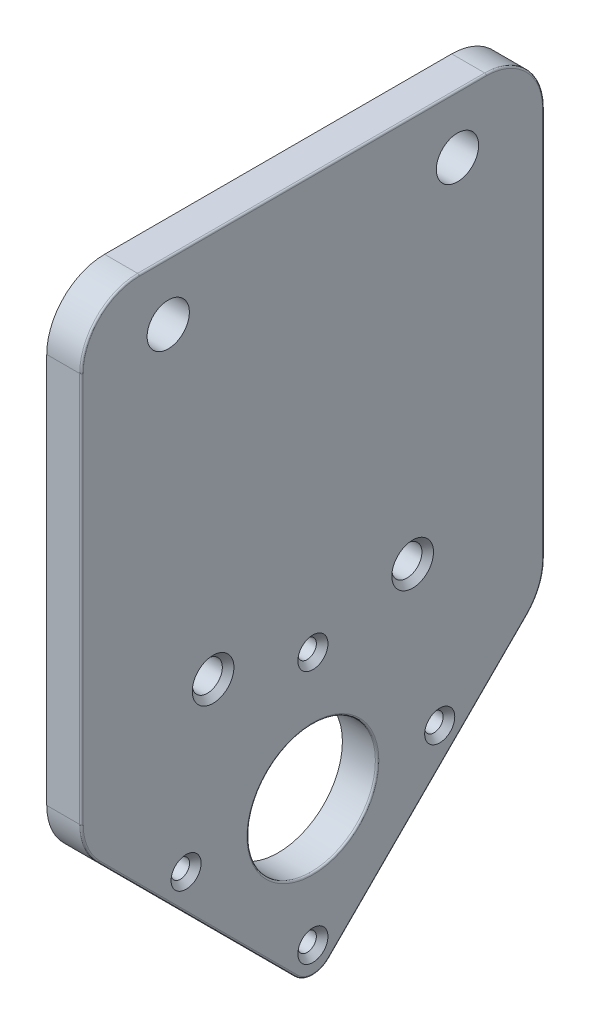
ISO-10303-21;
HEADER;
FILE_DESCRIPTION(('STEP AP214'),'2;1');
FILE_NAME('part.step','',(''),(''),'','','');
FILE_SCHEMA(('AUTOMOTIVE_DESIGN { 1 0 10303 214 1 1 1 1 }'));
ENDSEC;
DATA;
#1=APPLICATION_CONTEXT('core data for automotive mechanical design processes');
#2=APPLICATION_PROTOCOL_DEFINITION('international standard','automotive_design',2000,#1);
#3=PRODUCT_CONTEXT('',#1,'mechanical');
#4=PRODUCT('Part','Part','',(#3));
#5=PRODUCT_RELATED_PRODUCT_CATEGORY('part','',(#4));
#6=PRODUCT_DEFINITION_FORMATION('','',#4);
#7=PRODUCT_DEFINITION_CONTEXT('part definition',#1,'design');
#8=PRODUCT_DEFINITION('design','',#6,#7);
#9=PRODUCT_DEFINITION_SHAPE('','',#8);
#10=(LENGTH_UNIT() NAMED_UNIT(*) SI_UNIT(.MILLI.,.METRE.));
#11=(NAMED_UNIT(*) PLANE_ANGLE_UNIT() SI_UNIT($,.RADIAN.));
#12=(NAMED_UNIT(*) SI_UNIT($,.STERADIAN.) SOLID_ANGLE_UNIT());
#13=UNCERTAINTY_MEASURE_WITH_UNIT(LENGTH_MEASURE(1.E-05),#10,'distance_accuracy_value','');
#14=(GEOMETRIC_REPRESENTATION_CONTEXT(3) GLOBAL_UNCERTAINTY_ASSIGNED_CONTEXT((#13)) GLOBAL_UNIT_ASSIGNED_CONTEXT((#10,
#11,#12)) REPRESENTATION_CONTEXT('',''));
#15=CARTESIAN_POINT('',(0.,0.,0.));
#16=DIRECTION('',(0.,0.,1.));
#17=DIRECTION('',(1.,0.,0.));
#18=AXIS2_PLACEMENT_3D('',#15,#16,#17);
#19=CARTESIAN_POINT('',(6.,37.1129,-30.));
#20=DIRECTION('',(1.,0.,0.));
#21=DIRECTION('',(0.,0.,-1.));
#22=AXIS2_PLACEMENT_3D('',#19,#20,#21);
#23=PLANE('',#22);
#24=CARTESIAN_POINT('',(6.,-19.8871,-17.25));
#25=DIRECTION('',(1.,0.,0.));
#26=DIRECTION('',(0.,0.,-1.));
#27=AXIS2_PLACEMENT_3D('',#24,#25,#26);
#28=CIRCLE('',#27,3.60000000000003);
#29=CARTESIAN_POINT('',(6.,-19.8871,-20.85));
#30=VERTEX_POINT('',#29);
#31=EDGE_CURVE('E305',#30,#30,#28,.F.);
#32=ORIENTED_EDGE('',*,*,#31,.T.);
#33=EDGE_LOOP('',(#32));
#34=FACE_BOUND('',#33,.T.);
#35=CARTESIAN_POINT('',(6.,-19.8871,17.25));
#36=DIRECTION('',(1.,0.,0.));
#37=DIRECTION('',(0.,0.,-1.));
#38=AXIS2_PLACEMENT_3D('',#35,#36,#37);
#39=CIRCLE('',#38,3.60000000000003);
#40=CARTESIAN_POINT('',(6.,-19.8871,13.65));
#41=VERTEX_POINT('',#40);
#42=EDGE_CURVE('E302',#41,#41,#39,.F.);
#43=ORIENTED_EDGE('',*,*,#42,.T.);
#44=EDGE_LOOP('',(#43));
#45=FACE_BOUND('',#44,.T.);
#46=CARTESIAN_POINT('',(6.,-68.3074102167827,-0.00690000000000413));
#47=DIRECTION('',(1.,0.,0.));
#48=DIRECTION('',(0.,0.,-1.));
#49=AXIS2_PLACEMENT_3D('',#46,#47,#48);
#50=CIRCLE('',#49,2.6);
#51=CARTESIAN_POINT('',(6.,-68.3074102167827,-2.60690000000001));
#52=VERTEX_POINT('',#51);
#53=EDGE_CURVE('E299',#52,#52,#50,.F.);
#54=ORIENTED_EDGE('',*,*,#53,.T.);
#55=EDGE_LOOP('',(#54));
#56=FACE_BOUND('',#55,.T.);
#57=CARTESIAN_POINT('',(6.,-46.3870999999996,-21.927210216783));
#58=DIRECTION('',(1.,0.,0.));
#59=DIRECTION('',(0.,0.,-1.));
#60=AXIS2_PLACEMENT_3D('',#57,#58,#59);
#61=CIRCLE('',#60,2.6);
#62=CARTESIAN_POINT('',(6.,-46.3870999999996,-24.527210216783));
#63=VERTEX_POINT('',#62);
#64=EDGE_CURVE('E296',#63,#63,#61,.F.);
#65=ORIENTED_EDGE('',*,*,#64,.T.);
#66=EDGE_LOOP('',(#65));
#67=FACE_BOUND('',#66,.T.);
#68=CARTESIAN_POINT('',(6.,-46.3870999999997,21.913410216783));
#69=DIRECTION('',(1.,0.,0.));
#70=DIRECTION('',(0.,0.,-1.));
#71=AXIS2_PLACEMENT_3D('',#68,#69,#70);
#72=CIRCLE('',#71,2.6);
#73=CARTESIAN_POINT('',(6.,-46.3870999999997,19.313410216783));
#74=VERTEX_POINT('',#73);
#75=EDGE_CURVE('E293',#74,#74,#72,.F.);
#76=ORIENTED_EDGE('',*,*,#75,.T.);
#77=EDGE_LOOP('',(#76));
#78=FACE_BOUND('',#77,.T.);
#79=CARTESIAN_POINT('',(6.,-24.4667897832167,-0.00689999999985147));
#80=DIRECTION('',(1.,0.,0.));
#81=DIRECTION('',(0.,0.,-1.));
#82=AXIS2_PLACEMENT_3D('',#79,#80,#81);
#83=CIRCLE('',#82,2.6);
#84=CARTESIAN_POINT('',(6.,-24.4667897832167,-2.60689999999986));
#85=VERTEX_POINT('',#84);
#86=EDGE_CURVE('E290',#85,#85,#83,.F.);
#87=ORIENTED_EDGE('',*,*,#86,.T.);
#88=EDGE_LOOP('',(#87));
#89=FACE_BOUND('',#88,.T.);
#90=DIRECTION('',(0.,-0.707106781186547,-0.707106781186548));
#91=VECTOR('',#90,1.);
#92=CARTESIAN_POINT('',(6.,-71.492984615182,2.61629509039032));
#93=LINE('',#92,#91);
#94=CARTESIAN_POINT('',(6.,-37.2503439280628,36.8589357775095));
#95=VERTEX_POINT('',#94);
#96=CARTESIAN_POINT('',(6.,-71.492984615182,2.61629509039033));
#97=VERTEX_POINT('',#96);
#98=EDGE_CURVE('E232',#95,#97,#93,.T.);
#99=ORIENTED_EDGE('',*,*,#98,.T.);
#100=CARTESIAN_POINT('',(6.,-68.8766895247917,1.29007915461443E-13));
#101=DIRECTION('',(1.,0.,0.));
#102=DIRECTION('',(0.,0.,-1.));
#103=AXIS2_PLACEMENT_3D('',#100,#101,#102);
#104=CIRCLE('',#103,3.70000000000001);
#105=CARTESIAN_POINT('',(6.,-71.492984615182,-2.61629509039009));
#106=VERTEX_POINT('',#105);
#107=EDGE_CURVE('E234',#97,#106,#104,.T.);
#108=ORIENTED_EDGE('',*,*,#107,.T.);
#109=DIRECTION('',(0.,0.707106781186545,-0.70710678118655));
#110=VECTOR('',#109,1.);
#111=CARTESIAN_POINT('',(6.,-37.2503439280628,-36.8589357775095));
#112=LINE('',#111,#110);
#113=CARTESIAN_POINT('',(6.,-37.2503439280628,-36.8589357775095));
#114=VERTEX_POINT('',#113);
#115=EDGE_CURVE('E216',#106,#114,#112,.T.);
#116=ORIENTED_EDGE('',*,*,#115,.T.);
#117=CARTESIAN_POINT('',(6.,-30.3914081505533,-30.));
#118=DIRECTION('',(1.,0.,0.));
#119=DIRECTION('',(0.,0.,-1.));
#120=AXIS2_PLACEMENT_3D('',#117,#118,#119);
#121=CIRCLE('',#120,9.7);
#122=CARTESIAN_POINT('',(6.,-30.3914081505533,-39.7));
#123=VERTEX_POINT('',#122);
#124=EDGE_CURVE('E218',#114,#123,#121,.T.);
#125=ORIENTED_EDGE('',*,*,#124,.T.);
#126=DIRECTION('',(0.,1.,0.));
#127=VECTOR('',#126,1.);
#128=CARTESIAN_POINT('',(6.,37.1129,-39.7));
#129=LINE('',#128,#127);
#130=CARTESIAN_POINT('',(6.,37.1129,-39.7));
#131=VERTEX_POINT('',#130);
#132=EDGE_CURVE('E220',#123,#131,#129,.T.);
#133=ORIENTED_EDGE('',*,*,#132,.T.);
#134=CARTESIAN_POINT('',(6.,37.1129,-30.));
#135=DIRECTION('',(1.,0.,0.));
#136=DIRECTION('',(0.,0.,-1.));
#137=AXIS2_PLACEMENT_3D('',#134,#135,#136);
#138=CIRCLE('',#137,9.7);
#139=CARTESIAN_POINT('',(6.,46.8129,-30.));
#140=VERTEX_POINT('',#139);
#141=EDGE_CURVE('E222',#131,#140,#138,.T.);
#142=ORIENTED_EDGE('',*,*,#141,.T.);
#143=DIRECTION('',(0.,0.,1.));
#144=VECTOR('',#143,1.);
#145=CARTESIAN_POINT('',(6.,46.8129,30.));
#146=LINE('',#145,#144);
#147=CARTESIAN_POINT('',(6.,46.8129,30.));
#148=VERTEX_POINT('',#147);
#149=EDGE_CURVE('E224',#140,#148,#146,.T.);
#150=ORIENTED_EDGE('',*,*,#149,.T.);
#151=CARTESIAN_POINT('',(6.,37.1129,30.));
#152=DIRECTION('',(1.,0.,0.));
#153=DIRECTION('',(0.,0.,-1.));
#154=AXIS2_PLACEMENT_3D('',#151,#152,#153);
#155=CIRCLE('',#154,9.7);
#156=CARTESIAN_POINT('',(6.,37.1129,39.7));
#157=VERTEX_POINT('',#156);
#158=EDGE_CURVE('E226',#148,#157,#155,.T.);
#159=ORIENTED_EDGE('',*,*,#158,.T.);
#160=DIRECTION('',(0.,-1.,0.));
#161=VECTOR('',#160,1.);
#162=CARTESIAN_POINT('',(6.,-30.3914081505533,39.7));
#163=LINE('',#162,#161);
#164=CARTESIAN_POINT('',(6.,-30.3914081505533,39.7));
#165=VERTEX_POINT('',#164);
#166=EDGE_CURVE('E228',#157,#165,#163,.T.);
#167=ORIENTED_EDGE('',*,*,#166,.T.);
#168=CARTESIAN_POINT('',(6.,-30.3914081505533,30.));
#169=DIRECTION('',(1.,0.,0.));
#170=DIRECTION('',(0.,0.,-1.));
#171=AXIS2_PLACEMENT_3D('',#168,#169,#170);
#172=CIRCLE('',#171,9.7);
#173=EDGE_CURVE('E230',#165,#95,#172,.T.);
#174=ORIENTED_EDGE('',*,*,#173,.T.);
#175=EDGE_LOOP('',(#99,#108,#116,#125,#133,#142,#150,#159,#167,#174));
#176=FACE_BOUND('',#175,.T.);
#177=CARTESIAN_POINT('',(6.,-46.3871,-0.0069));
#178=DIRECTION('',(1.,0.,0.));
#179=DIRECTION('',(0.,0.,-1.));
#180=AXIS2_PLACEMENT_3D('',#177,#178,#179);
#181=CIRCLE('',#180,11.4);
#182=CARTESIAN_POINT('',(6.,-46.3871,-11.4069));
#183=VERTEX_POINT('',#182);
#184=EDGE_CURVE('E154',#183,#183,#181,.F.);
#185=ORIENTED_EDGE('',*,*,#184,.T.);
#186=EDGE_LOOP('',(#185));
#187=FACE_BOUND('',#186,.T.);
#188=CARTESIAN_POINT('',(6.,37.1129,25.));
#189=DIRECTION('',(1.,0.,0.));
#190=DIRECTION('',(0.,0.,-1.));
#191=AXIS2_PLACEMENT_3D('',#188,#189,#190);
#192=CIRCLE('',#191,3.655);
#193=CARTESIAN_POINT('',(6.,37.1129,21.345));
#194=VERTEX_POINT('',#193);
#195=EDGE_CURVE('E504',#194,#194,#192,.T.);
#196=ORIENTED_EDGE('',*,*,#195,.F.);
#197=EDGE_LOOP('',(#196));
#198=FACE_BOUND('',#197,.T.);
#199=CARTESIAN_POINT('',(6.,37.1129,-25.));
#200=DIRECTION('',(1.,0.,0.));
#201=DIRECTION('',(0.,0.,-1.));
#202=AXIS2_PLACEMENT_3D('',#199,#200,#201);
#203=CIRCLE('',#202,3.655);
#204=CARTESIAN_POINT('',(6.,37.1129,-28.655));
#205=VERTEX_POINT('',#204);
#206=EDGE_CURVE('E496',#205,#205,#203,.T.);
#207=ORIENTED_EDGE('',*,*,#206,.F.);
#208=EDGE_LOOP('',(#207));
#209=FACE_BOUND('',#208,.T.);
#210=ADVANCED_FACE('F35',(#34,#45,#56,#67,#78,#89,#176,#187,#198,#209),#23,.T.);
#211=CARTESIAN_POINT('',(0.,37.1129,-30.));
#212=DIRECTION('',(1.,0.,0.));
#213=DIRECTION('',(0.,0.,-1.));
#214=AXIS2_PLACEMENT_3D('',#211,#212,#213);
#215=PLANE('',#214);
#216=CARTESIAN_POINT('',(0.,37.1129,-30.));
#217=DIRECTION('',(1.,0.,0.));
#218=DIRECTION('',(0.,0.,-1.));
#219=AXIS2_PLACEMENT_3D('',#216,#217,#218);
#220=CIRCLE('',#219,10.);
#221=CARTESIAN_POINT('',(0.,37.1129,-40.));
#222=VERTEX_POINT('',#221);
#223=CARTESIAN_POINT('',(0.,47.1129,-30.));
#224=VERTEX_POINT('',#223);
#225=EDGE_CURVE('E162',#222,#224,#220,.T.);
#226=ORIENTED_EDGE('',*,*,#225,.F.);
#227=DIRECTION('',(0.,1.,0.));
#228=VECTOR('',#227,1.);
#229=CARTESIAN_POINT('',(0.,37.1129,-40.));
#230=LINE('',#229,#228);
#231=CARTESIAN_POINT('',(0.,-30.3914081505533,-40.));
#232=VERTEX_POINT('',#231);
#233=EDGE_CURVE('E196',#232,#222,#230,.T.);
#234=ORIENTED_EDGE('',*,*,#233,.F.);
#235=CARTESIAN_POINT('',(0.,-30.3914081505533,-30.));
#236=DIRECTION('',(1.,0.,0.));
#237=DIRECTION('',(0.,0.,-1.));
#238=AXIS2_PLACEMENT_3D('',#235,#236,#237);
#239=CIRCLE('',#238,10.);
#240=CARTESIAN_POINT('',(0.,-37.4624759624188,-37.0710678118655));
#241=VERTEX_POINT('',#240);
#242=EDGE_CURVE('E193',#241,#232,#239,.T.);
#243=ORIENTED_EDGE('',*,*,#242,.F.);
#244=DIRECTION('',(0.,0.707106781186545,-0.70710678118655));
#245=VECTOR('',#244,1.);
#246=CARTESIAN_POINT('',(0.,-37.4624759624188,-37.0710678118655));
#247=LINE('',#246,#245);
#248=CARTESIAN_POINT('',(0.,-71.7051166495379,-2.82842712474607));
#249=VERTEX_POINT('',#248);
#250=EDGE_CURVE('E190',#249,#241,#247,.T.);
#251=ORIENTED_EDGE('',*,*,#250,.F.);
#252=CARTESIAN_POINT('',(0.,-68.8766895247917,1.29007915461443E-13));
#253=DIRECTION('',(1.,0.,0.));
#254=DIRECTION('',(0.,0.,-1.));
#255=AXIS2_PLACEMENT_3D('',#252,#253,#254);
#256=CIRCLE('',#255,4.00000000000001);
#257=CARTESIAN_POINT('',(0.,-71.7051166495379,2.8284271247463));
#258=VERTEX_POINT('',#257);
#259=EDGE_CURVE('E187',#258,#249,#256,.T.);
#260=ORIENTED_EDGE('',*,*,#259,.F.);
#261=DIRECTION('',(0.,-0.707106781186547,-0.707106781186548));
#262=VECTOR('',#261,1.);
#263=CARTESIAN_POINT('',(0.,-37.4624759624188,37.0710678118655));
#264=LINE('',#263,#262);
#265=CARTESIAN_POINT('',(0.,-37.4624759624188,37.0710678118655));
#266=VERTEX_POINT('',#265);
#267=EDGE_CURVE('E184',#266,#258,#264,.T.);
#268=ORIENTED_EDGE('',*,*,#267,.F.);
#269=CARTESIAN_POINT('',(0.,-30.3914081505533,30.));
#270=DIRECTION('',(1.,0.,0.));
#271=DIRECTION('',(0.,0.,-1.));
#272=AXIS2_PLACEMENT_3D('',#269,#270,#271);
#273=CIRCLE('',#272,10.);
#274=CARTESIAN_POINT('',(0.,-30.3914081505533,40.));
#275=VERTEX_POINT('',#274);
#276=EDGE_CURVE('E181',#275,#266,#273,.T.);
#277=ORIENTED_EDGE('',*,*,#276,.F.);
#278=DIRECTION('',(0.,-1.,0.));
#279=VECTOR('',#278,1.);
#280=CARTESIAN_POINT('',(0.,37.1129,40.));
#281=LINE('',#280,#279);
#282=CARTESIAN_POINT('',(0.,37.1129,40.));
#283=VERTEX_POINT('',#282);
#284=EDGE_CURVE('E178',#283,#275,#281,.T.);
#285=ORIENTED_EDGE('',*,*,#284,.F.);
#286=CARTESIAN_POINT('',(0.,37.1129,30.));
#287=DIRECTION('',(1.,0.,0.));
#288=DIRECTION('',(0.,0.,-1.));
#289=AXIS2_PLACEMENT_3D('',#286,#287,#288);
#290=CIRCLE('',#289,10.);
#291=CARTESIAN_POINT('',(0.,47.1129,30.));
#292=VERTEX_POINT('',#291);
#293=EDGE_CURVE('E165',#292,#283,#290,.T.);
#294=ORIENTED_EDGE('',*,*,#293,.F.);
#295=DIRECTION('',(0.,0.,1.));
#296=VECTOR('',#295,1.);
#297=CARTESIAN_POINT('',(0.,47.1129,30.));
#298=LINE('',#297,#296);
#299=EDGE_CURVE('E147',#224,#292,#298,.T.);
#300=ORIENTED_EDGE('',*,*,#299,.F.);
#301=EDGE_LOOP('',(#226,#234,#243,#251,#260,#268,#277,#285,#294,#300));
#302=FACE_BOUND('',#301,.T.);
#303=CARTESIAN_POINT('',(0.,-24.4667897832167,-0.00689999999985147));
#304=DIRECTION('',(1.,0.,0.));
#305=DIRECTION('',(0.,0.,-1.));
#306=AXIS2_PLACEMENT_3D('',#303,#304,#305);
#307=CIRCLE('',#306,1.6);
#308=CARTESIAN_POINT('',(0.,-24.4667897832167,-1.60689999999985));
#309=VERTEX_POINT('',#308);
#310=EDGE_CURVE('E170',#309,#309,#307,.T.);
#311=ORIENTED_EDGE('',*,*,#310,.T.);
#312=EDGE_LOOP('',(#311));
#313=FACE_BOUND('',#312,.T.);
#314=CARTESIAN_POINT('',(0.,-46.3870999999997,21.913410216783));
#315=DIRECTION('',(1.,0.,0.));
#316=DIRECTION('',(0.,0.,-1.));
#317=AXIS2_PLACEMENT_3D('',#314,#315,#316);
#318=CIRCLE('',#317,1.6);
#319=CARTESIAN_POINT('',(0.,-46.3870999999997,20.313410216783));
#320=VERTEX_POINT('',#319);
#321=EDGE_CURVE('E173',#320,#320,#318,.T.);
#322=ORIENTED_EDGE('',*,*,#321,.T.);
#323=EDGE_LOOP('',(#322));
#324=FACE_BOUND('',#323,.T.);
#325=CARTESIAN_POINT('',(0.,-46.3870999999996,-21.927210216783));
#326=DIRECTION('',(1.,0.,0.));
#327=DIRECTION('',(0.,0.,-1.));
#328=AXIS2_PLACEMENT_3D('',#325,#326,#327);
#329=CIRCLE('',#328,1.6);
#330=CARTESIAN_POINT('',(0.,-46.3870999999996,-23.527210216783));
#331=VERTEX_POINT('',#330);
#332=EDGE_CURVE('E452',#331,#331,#329,.T.);
#333=ORIENTED_EDGE('',*,*,#332,.T.);
#334=EDGE_LOOP('',(#333));
#335=FACE_BOUND('',#334,.T.);
#336=CARTESIAN_POINT('',(0.,-68.3074102167827,-0.00690000000000413));
#337=DIRECTION('',(1.,0.,0.));
#338=DIRECTION('',(0.,0.,-1.));
#339=AXIS2_PLACEMENT_3D('',#336,#337,#338);
#340=CIRCLE('',#339,1.6);
#341=CARTESIAN_POINT('',(0.,-68.3074102167827,-1.60690000000001));
#342=VERTEX_POINT('',#341);
#343=EDGE_CURVE('E450',#342,#342,#340,.T.);
#344=ORIENTED_EDGE('',*,*,#343,.T.);
#345=EDGE_LOOP('',(#344));
#346=FACE_BOUND('',#345,.T.);
#347=CARTESIAN_POINT('',(0.,-19.8871,-17.25));
#348=DIRECTION('',(1.,0.,0.));
#349=DIRECTION('',(0.,0.,-1.));
#350=AXIS2_PLACEMENT_3D('',#347,#348,#349);
#351=CIRCLE('',#350,2.6);
#352=CARTESIAN_POINT('',(0.,-19.8871,-19.85));
#353=VERTEX_POINT('',#352);
#354=EDGE_CURVE('E453',#353,#353,#351,.T.);
#355=ORIENTED_EDGE('',*,*,#354,.T.);
#356=EDGE_LOOP('',(#355));
#357=FACE_BOUND('',#356,.T.);
#358=CARTESIAN_POINT('',(0.,-19.8871,17.25));
#359=DIRECTION('',(1.,0.,0.));
#360=DIRECTION('',(0.,0.,-1.));
#361=AXIS2_PLACEMENT_3D('',#358,#359,#360);
#362=CIRCLE('',#361,2.6);
#363=CARTESIAN_POINT('',(0.,-19.8871,14.65));
#364=VERTEX_POINT('',#363);
#365=EDGE_CURVE('E458',#364,#364,#362,.T.);
#366=ORIENTED_EDGE('',*,*,#365,.T.);
#367=EDGE_LOOP('',(#366));
#368=FACE_BOUND('',#367,.T.);
#369=CARTESIAN_POINT('',(0.,-46.3871,-0.0069));
#370=DIRECTION('',(1.,0.,0.));
#371=DIRECTION('',(0.,0.,-1.));
#372=AXIS2_PLACEMENT_3D('',#369,#370,#371);
#373=CIRCLE('',#372,11.1);
#374=CARTESIAN_POINT('',(0.,-46.3871,-11.1069));
#375=VERTEX_POINT('',#374);
#376=EDGE_CURVE('E507',#375,#375,#373,.T.);
#377=ORIENTED_EDGE('',*,*,#376,.T.);
#378=EDGE_LOOP('',(#377));
#379=FACE_BOUND('',#378,.T.);
#380=CARTESIAN_POINT('',(0.,37.1129,25.));
#381=DIRECTION('',(1.,0.,0.));
#382=DIRECTION('',(0.,0.,-1.));
#383=AXIS2_PLACEMENT_3D('',#380,#381,#382);
#384=CIRCLE('',#383,3.655);
#385=CARTESIAN_POINT('',(0.,37.1129,21.345));
#386=VERTEX_POINT('',#385);
#387=EDGE_CURVE('E501',#386,#386,#384,.T.);
#388=ORIENTED_EDGE('',*,*,#387,.T.);
#389=EDGE_LOOP('',(#388));
#390=FACE_BOUND('',#389,.T.);
#391=CARTESIAN_POINT('',(0.,37.1129,-25.));
#392=DIRECTION('',(1.,0.,0.));
#393=DIRECTION('',(0.,0.,-1.));
#394=AXIS2_PLACEMENT_3D('',#391,#392,#393);
#395=CIRCLE('',#394,3.655);
#396=CARTESIAN_POINT('',(0.,37.1129,-28.655));
#397=VERTEX_POINT('',#396);
#398=EDGE_CURVE('E287',#397,#397,#395,.T.);
#399=ORIENTED_EDGE('',*,*,#398,.T.);
#400=EDGE_LOOP('',(#399));
#401=FACE_BOUND('',#400,.T.);
#402=ADVANCED_FACE('F159',(#302,#313,#324,#335,#346,#357,#368,#379,#390,#401),#215,.F.);
#403=CARTESIAN_POINT('',(6.,37.1129,-30.));
#404=DIRECTION('',(-1.,0.,0.));
#405=DIRECTION('',(0.,0.,1.));
#406=AXIS2_PLACEMENT_3D('',#403,#404,#405);
#407=CYLINDRICAL_SURFACE('',#406,10.);
#408=DIRECTION('',(-1.,0.,0.));
#409=VECTOR('',#408,1.);
#410=CARTESIAN_POINT('',(6.,47.1129,-30.));
#411=LINE('',#410,#409);
#412=CARTESIAN_POINT('',(5.7,47.1129,-30.));
#413=VERTEX_POINT('',#412);
#414=EDGE_CURVE('E143',#413,#224,#411,.T.);
#415=ORIENTED_EDGE('',*,*,#414,.F.);
#416=CARTESIAN_POINT('',(5.7,37.1129,-30.));
#417=DIRECTION('',(1.,0.,0.));
#418=DIRECTION('',(0.,0.,-1.));
#419=AXIS2_PLACEMENT_3D('',#416,#417,#418);
#420=CIRCLE('',#419,10.);
#421=CARTESIAN_POINT('',(5.7,37.1129,-40.));
#422=VERTEX_POINT('',#421);
#423=EDGE_CURVE('E249',#413,#422,#420,.F.);
#424=ORIENTED_EDGE('',*,*,#423,.T.);
#425=DIRECTION('',(-1.,0.,0.));
#426=VECTOR('',#425,1.);
#427=CARTESIAN_POINT('',(6.,37.1129,-40.));
#428=LINE('',#427,#426);
#429=EDGE_CURVE('E168',#422,#222,#428,.T.);
#430=ORIENTED_EDGE('',*,*,#429,.T.);
#431=ORIENTED_EDGE('',*,*,#225,.T.);
#432=EDGE_LOOP('',(#415,#424,#430,#431));
#433=FACE_BOUND('',#432,.T.);
#434=ADVANCED_FACE('F167',(#433),#407,.T.);
#435=CARTESIAN_POINT('',(6.,47.1129,30.));
#436=DIRECTION('',(0.,-1.,0.));
#437=DIRECTION('',(0.,0.,-1.));
#438=AXIS2_PLACEMENT_3D('',#435,#436,#437);
#439=PLANE('',#438);
#440=DIRECTION('',(-1.,0.,0.));
#441=VECTOR('',#440,1.);
#442=CARTESIAN_POINT('',(6.,47.1129,30.));
#443=LINE('',#442,#441);
#444=CARTESIAN_POINT('',(5.7,47.1129,30.));
#445=VERTEX_POINT('',#444);
#446=EDGE_CURVE('E155',#445,#292,#443,.T.);
#447=ORIENTED_EDGE('',*,*,#446,.F.);
#448=DIRECTION('',(0.,0.,1.));
#449=VECTOR('',#448,1.);
#450=CARTESIAN_POINT('',(5.7,47.1129,-30.));
#451=LINE('',#450,#449);
#452=EDGE_CURVE('E150',#445,#413,#451,.F.);
#453=ORIENTED_EDGE('',*,*,#452,.T.);
#454=ORIENTED_EDGE('',*,*,#414,.T.);
#455=ORIENTED_EDGE('',*,*,#299,.T.);
#456=EDGE_LOOP('',(#447,#453,#454,#455));
#457=FACE_BOUND('',#456,.T.);
#458=ADVANCED_FACE('F146',(#457),#439,.F.);
#459=CARTESIAN_POINT('',(6.,37.1129,30.));
#460=DIRECTION('',(-1.,0.,0.));
#461=DIRECTION('',(0.,0.,1.));
#462=AXIS2_PLACEMENT_3D('',#459,#460,#461);
#463=CYLINDRICAL_SURFACE('',#462,10.);
#464=DIRECTION('',(-1.,0.,0.));
#465=VECTOR('',#464,1.);
#466=CARTESIAN_POINT('',(6.,37.1129,40.));
#467=LINE('',#466,#465);
#468=CARTESIAN_POINT('',(5.7,37.1129,40.));
#469=VERTEX_POINT('',#468);
#470=EDGE_CURVE('E211',#469,#283,#467,.T.);
#471=ORIENTED_EDGE('',*,*,#470,.F.);
#472=CARTESIAN_POINT('',(5.7,37.1129,30.));
#473=DIRECTION('',(1.,0.,0.));
#474=DIRECTION('',(0.,0.,-1.));
#475=AXIS2_PLACEMENT_3D('',#472,#473,#474);
#476=CIRCLE('',#475,10.);
#477=EDGE_CURVE('E246',#469,#445,#476,.F.);
#478=ORIENTED_EDGE('',*,*,#477,.T.);
#479=ORIENTED_EDGE('',*,*,#446,.T.);
#480=ORIENTED_EDGE('',*,*,#293,.T.);
#481=EDGE_LOOP('',(#471,#478,#479,#480));
#482=FACE_BOUND('',#481,.T.);
#483=ADVANCED_FACE('F372',(#482),#463,.T.);
#484=CARTESIAN_POINT('',(6.,37.1129,40.));
#485=DIRECTION('',(0.,0.,-1.));
#486=DIRECTION('',(0.,1.,0.));
#487=AXIS2_PLACEMENT_3D('',#484,#485,#486);
#488=PLANE('',#487);
#489=DIRECTION('',(-1.,0.,0.));
#490=VECTOR('',#489,1.);
#491=CARTESIAN_POINT('',(6.,-30.3914081505533,40.));
#492=LINE('',#491,#490);
#493=CARTESIAN_POINT('',(5.7,-30.3914081505533,40.));
#494=VERTEX_POINT('',#493);
#495=EDGE_CURVE('E209',#494,#275,#492,.T.);
#496=ORIENTED_EDGE('',*,*,#495,.F.);
#497=DIRECTION('',(0.,-1.,0.));
#498=VECTOR('',#497,1.);
#499=CARTESIAN_POINT('',(5.7,37.1129,40.));
#500=LINE('',#499,#498);
#501=EDGE_CURVE('E244',#494,#469,#500,.F.);
#502=ORIENTED_EDGE('',*,*,#501,.T.);
#503=ORIENTED_EDGE('',*,*,#470,.T.);
#504=ORIENTED_EDGE('',*,*,#284,.T.);
#505=EDGE_LOOP('',(#496,#502,#503,#504));
#506=FACE_BOUND('',#505,.T.);
#507=ADVANCED_FACE('F368',(#506),#488,.F.);
#508=CARTESIAN_POINT('',(6.,-30.3914081505533,30.));
#509=DIRECTION('',(-1.,0.,0.));
#510=DIRECTION('',(0.,0.,1.));
#511=AXIS2_PLACEMENT_3D('',#508,#509,#510);
#512=CYLINDRICAL_SURFACE('',#511,10.);
#513=DIRECTION('',(-1.,0.,0.));
#514=VECTOR('',#513,1.);
#515=CARTESIAN_POINT('',(6.,-37.4624759624188,37.0710678118655));
#516=LINE('',#515,#514);
#517=CARTESIAN_POINT('',(5.7,-37.4624759624188,37.0710678118655));
#518=VERTEX_POINT('',#517);
#519=EDGE_CURVE('E207',#518,#266,#516,.T.);
#520=ORIENTED_EDGE('',*,*,#519,.F.);
#521=CARTESIAN_POINT('',(5.7,-30.3914081505533,30.));
#522=DIRECTION('',(1.,0.,0.));
#523=DIRECTION('',(0.,0.,-1.));
#524=AXIS2_PLACEMENT_3D('',#521,#522,#523);
#525=CIRCLE('',#524,10.);
#526=EDGE_CURVE('E242',#518,#494,#525,.F.);
#527=ORIENTED_EDGE('',*,*,#526,.T.);
#528=ORIENTED_EDGE('',*,*,#495,.T.);
#529=ORIENTED_EDGE('',*,*,#276,.T.);
#530=EDGE_LOOP('',(#520,#527,#528,#529));
#531=FACE_BOUND('',#530,.T.);
#532=ADVANCED_FACE('F364',(#531),#512,.T.);
#533=CARTESIAN_POINT('',(6.,-37.4624759624188,37.0710678118655));
#534=DIRECTION('',(0.,0.707106781186548,-0.707106781186547));
#535=DIRECTION('',(0.,0.707106781186547,0.707106781186548));
#536=AXIS2_PLACEMENT_3D('',#533,#534,#535);
#537=PLANE('',#536);
#538=DIRECTION('',(-1.,0.,0.));
#539=VECTOR('',#538,1.);
#540=CARTESIAN_POINT('',(6.,-71.7051166495379,2.8284271247463));
#541=LINE('',#540,#539);
#542=CARTESIAN_POINT('',(5.7,-71.7051166495379,2.8284271247463));
#543=VERTEX_POINT('',#542);
#544=EDGE_CURVE('E205',#543,#258,#541,.T.);
#545=ORIENTED_EDGE('',*,*,#544,.F.);
#546=DIRECTION('',(0.,-0.707106781186547,-0.707106781186548));
#547=VECTOR('',#546,1.);
#548=CARTESIAN_POINT('',(5.7,-37.4624759624188,37.0710678118655));
#549=LINE('',#548,#547);
#550=EDGE_CURVE('E240',#543,#518,#549,.F.);
#551=ORIENTED_EDGE('',*,*,#550,.T.);
#552=ORIENTED_EDGE('',*,*,#519,.T.);
#553=ORIENTED_EDGE('',*,*,#267,.T.);
#554=EDGE_LOOP('',(#545,#551,#552,#553));
#555=FACE_BOUND('',#554,.T.);
#556=ADVANCED_FACE('F360',(#555),#537,.F.);
#557=CARTESIAN_POINT('',(6.,-68.8766895247917,1.29007915461443E-13));
#558=DIRECTION('',(-1.,0.,0.));
#559=DIRECTION('',(0.,0.,1.));
#560=AXIS2_PLACEMENT_3D('',#557,#558,#559);
#561=CYLINDRICAL_SURFACE('',#560,4.00000000000001);
#562=DIRECTION('',(-1.,0.,0.));
#563=VECTOR('',#562,1.);
#564=CARTESIAN_POINT('',(6.,-71.7051166495379,-2.82842712474607));
#565=LINE('',#564,#563);
#566=CARTESIAN_POINT('',(5.7,-71.7051166495379,-2.82842712474607));
#567=VERTEX_POINT('',#566);
#568=EDGE_CURVE('E203',#567,#249,#565,.T.);
#569=ORIENTED_EDGE('',*,*,#568,.F.);
#570=CARTESIAN_POINT('',(5.7,-68.8766895247917,1.29007915461443E-13));
#571=DIRECTION('',(1.,0.,0.));
#572=DIRECTION('',(0.,0.,-1.));
#573=AXIS2_PLACEMENT_3D('',#570,#571,#572);
#574=CIRCLE('',#573,4.00000000000001);
#575=EDGE_CURVE('E237',#567,#543,#574,.F.);
#576=ORIENTED_EDGE('',*,*,#575,.T.);
#577=ORIENTED_EDGE('',*,*,#544,.T.);
#578=ORIENTED_EDGE('',*,*,#259,.T.);
#579=EDGE_LOOP('',(#569,#576,#577,#578));
#580=FACE_BOUND('',#579,.T.);
#581=ADVANCED_FACE('F356',(#580),#561,.T.);
#582=CARTESIAN_POINT('',(6.,-37.4624759624188,-37.0710678118655));
#583=DIRECTION('',(0.,0.70710678118655,0.707106781186545));
#584=DIRECTION('',(0.,-0.707106781186545,0.70710678118655));
#585=AXIS2_PLACEMENT_3D('',#582,#583,#584);
#586=PLANE('',#585);
#587=DIRECTION('',(-1.,0.,0.));
#588=VECTOR('',#587,1.);
#589=CARTESIAN_POINT('',(6.,-37.4624759624188,-37.0710678118655));
#590=LINE('',#589,#588);
#591=CARTESIAN_POINT('',(5.7,-37.4624759624188,-37.0710678118655));
#592=VERTEX_POINT('',#591);
#593=EDGE_CURVE('E201',#592,#241,#590,.T.);
#594=ORIENTED_EDGE('',*,*,#593,.F.);
#595=DIRECTION('',(0.,0.707106781186545,-0.70710678118655));
#596=VECTOR('',#595,1.);
#597=CARTESIAN_POINT('',(5.7,-71.705116649538,-2.82842712474606));
#598=LINE('',#597,#596);
#599=EDGE_CURVE('E253',#592,#567,#598,.F.);
#600=ORIENTED_EDGE('',*,*,#599,.T.);
#601=ORIENTED_EDGE('',*,*,#568,.T.);
#602=ORIENTED_EDGE('',*,*,#250,.T.);
#603=EDGE_LOOP('',(#594,#600,#601,#602));
#604=FACE_BOUND('',#603,.T.);
#605=ADVANCED_FACE('F353',(#604),#586,.F.);
#606=CARTESIAN_POINT('',(6.,-30.3914081505533,-30.));
#607=DIRECTION('',(-1.,0.,0.));
#608=DIRECTION('',(0.,0.,1.));
#609=AXIS2_PLACEMENT_3D('',#606,#607,#608);
#610=CYLINDRICAL_SURFACE('',#609,10.);
#611=DIRECTION('',(-1.,0.,0.));
#612=VECTOR('',#611,1.);
#613=CARTESIAN_POINT('',(6.,-30.3914081505533,-40.));
#614=LINE('',#613,#612);
#615=CARTESIAN_POINT('',(5.7,-30.3914081505533,-40.));
#616=VERTEX_POINT('',#615);
#617=EDGE_CURVE('E199',#616,#232,#614,.T.);
#618=ORIENTED_EDGE('',*,*,#617,.F.);
#619=CARTESIAN_POINT('',(5.7,-30.3914081505533,-30.));
#620=DIRECTION('',(1.,0.,0.));
#621=DIRECTION('',(0.,0.,-1.));
#622=AXIS2_PLACEMENT_3D('',#619,#620,#621);
#623=CIRCLE('',#622,10.);
#624=EDGE_CURVE('E50',#616,#592,#623,.F.);
#625=ORIENTED_EDGE('',*,*,#624,.T.);
#626=ORIENTED_EDGE('',*,*,#593,.T.);
#627=ORIENTED_EDGE('',*,*,#242,.T.);
#628=EDGE_LOOP('',(#618,#625,#626,#627));
#629=FACE_BOUND('',#628,.T.);
#630=ADVANCED_FACE('F350',(#629),#610,.T.);
#631=CARTESIAN_POINT('',(6.,37.1129,-40.));
#632=DIRECTION('',(0.,0.,1.));
#633=DIRECTION('',(1.,0.,0.));
#634=AXIS2_PLACEMENT_3D('',#631,#632,#633);
#635=PLANE('',#634);
#636=ORIENTED_EDGE('',*,*,#429,.F.);
#637=DIRECTION('',(0.,1.,0.));
#638=VECTOR('',#637,1.);
#639=CARTESIAN_POINT('',(5.7,-30.3914081505533,-40.));
#640=LINE('',#639,#638);
#641=EDGE_CURVE('E58',#422,#616,#640,.F.);
#642=ORIENTED_EDGE('',*,*,#641,.T.);
#643=ORIENTED_EDGE('',*,*,#617,.T.);
#644=ORIENTED_EDGE('',*,*,#233,.T.);
#645=EDGE_LOOP('',(#636,#642,#643,#644));
#646=FACE_BOUND('',#645,.T.);
#647=ADVANCED_FACE('F347',(#646),#635,.F.);
#648=CARTESIAN_POINT('',(6.,-24.4667897832167,-0.00689999999985147));
#649=DIRECTION('',(-1.,0.,0.));
#650=DIRECTION('',(0.,0.,1.));
#651=AXIS2_PLACEMENT_3D('',#648,#649,#650);
#652=CYLINDRICAL_SURFACE('',#651,1.6);
#653=CARTESIAN_POINT('',(4.99999999999999,-24.4667897832167,-0.00689999999985147));
#654=DIRECTION('',(1.,0.,0.));
#655=DIRECTION('',(0.,0.,-1.));
#656=AXIS2_PLACEMENT_3D('',#653,#654,#655);
#657=CIRCLE('',#656,1.6);
#658=CARTESIAN_POINT('',(4.99999999999999,-24.4667897832167,-1.60689999999985));
#659=VERTEX_POINT('',#658);
#660=EDGE_CURVE('E11',#659,#659,#657,.T.);
#661=ORIENTED_EDGE('',*,*,#660,.T.);
#662=EDGE_LOOP('',(#661));
#663=FACE_BOUND('',#662,.T.);
#664=ORIENTED_EDGE('',*,*,#310,.F.);
#665=EDGE_LOOP('',(#664));
#666=FACE_BOUND('',#665,.T.);
#667=ADVANCED_FACE('F344',(#663,#666),#652,.F.);
#668=CARTESIAN_POINT('',(6.,-46.3870999999997,21.913410216783));
#669=DIRECTION('',(-1.,0.,0.));
#670=DIRECTION('',(0.,0.,1.));
#671=AXIS2_PLACEMENT_3D('',#668,#669,#670);
#672=CYLINDRICAL_SURFACE('',#671,1.6);
#673=CARTESIAN_POINT('',(4.99999999999999,-46.3870999999997,21.913410216783));
#674=DIRECTION('',(1.,0.,0.));
#675=DIRECTION('',(0.,0.,-1.));
#676=AXIS2_PLACEMENT_3D('',#673,#674,#675);
#677=CIRCLE('',#676,1.6);
#678=CARTESIAN_POINT('',(4.99999999999999,-46.3870999999997,20.313410216783));
#679=VERTEX_POINT('',#678);
#680=EDGE_CURVE('E43',#679,#679,#677,.T.);
#681=ORIENTED_EDGE('',*,*,#680,.T.);
#682=EDGE_LOOP('',(#681));
#683=FACE_BOUND('',#682,.T.);
#684=ORIENTED_EDGE('',*,*,#321,.F.);
#685=EDGE_LOOP('',(#684));
#686=FACE_BOUND('',#685,.T.);
#687=ADVANCED_FACE('F319',(#683,#686),#672,.F.);
#688=CARTESIAN_POINT('',(6.,-46.3870999999996,-21.927210216783));
#689=DIRECTION('',(-1.,0.,0.));
#690=DIRECTION('',(0.,0.,1.));
#691=AXIS2_PLACEMENT_3D('',#688,#689,#690);
#692=CYLINDRICAL_SURFACE('',#691,1.6);
#693=CARTESIAN_POINT('',(4.99999999999999,-46.3870999999996,-21.927210216783));
#694=DIRECTION('',(1.,0.,0.));
#695=DIRECTION('',(0.,0.,-1.));
#696=AXIS2_PLACEMENT_3D('',#693,#694,#695);
#697=CIRCLE('',#696,1.6);
#698=CARTESIAN_POINT('',(4.99999999999999,-46.3870999999996,-23.527210216783));
#699=VERTEX_POINT('',#698);
#700=EDGE_CURVE('E314',#699,#699,#697,.T.);
#701=ORIENTED_EDGE('',*,*,#700,.T.);
#702=EDGE_LOOP('',(#701));
#703=FACE_BOUND('',#702,.T.);
#704=ORIENTED_EDGE('',*,*,#332,.F.);
#705=EDGE_LOOP('',(#704));
#706=FACE_BOUND('',#705,.T.);
#707=ADVANCED_FACE('F446',(#703,#706),#692,.F.);
#708=CARTESIAN_POINT('',(6.,-68.3074102167827,-0.00690000000000413));
#709=DIRECTION('',(-1.,0.,0.));
#710=DIRECTION('',(0.,0.,1.));
#711=AXIS2_PLACEMENT_3D('',#708,#709,#710);
#712=CYLINDRICAL_SURFACE('',#711,1.6);
#713=CARTESIAN_POINT('',(4.99999999999999,-68.3074102167827,-0.00690000000000413));
#714=DIRECTION('',(1.,0.,0.));
#715=DIRECTION('',(0.,0.,-1.));
#716=AXIS2_PLACEMENT_3D('',#713,#714,#715);
#717=CIRCLE('',#716,1.6);
#718=CARTESIAN_POINT('',(4.99999999999999,-68.3074102167827,-1.60690000000001));
#719=VERTEX_POINT('',#718);
#720=EDGE_CURVE('E311',#719,#719,#717,.T.);
#721=ORIENTED_EDGE('',*,*,#720,.T.);
#722=EDGE_LOOP('',(#721));
#723=FACE_BOUND('',#722,.T.);
#724=ORIENTED_EDGE('',*,*,#343,.F.);
#725=EDGE_LOOP('',(#724));
#726=FACE_BOUND('',#725,.T.);
#727=ADVANCED_FACE('F442',(#723,#726),#712,.F.);
#728=CARTESIAN_POINT('',(6.,-19.8871,-17.25));
#729=DIRECTION('',(-1.,0.,0.));
#730=DIRECTION('',(0.,0.,1.));
#731=AXIS2_PLACEMENT_3D('',#728,#729,#730);
#732=CYLINDRICAL_SURFACE('',#731,2.6);
#733=CARTESIAN_POINT('',(4.99999999999996,-19.8871,-17.25));
#734=DIRECTION('',(1.,0.,0.));
#735=DIRECTION('',(0.,0.,-1.));
#736=AXIS2_PLACEMENT_3D('',#733,#734,#735);
#737=CIRCLE('',#736,2.6);
#738=CARTESIAN_POINT('',(4.99999999999996,-19.8871,-19.85));
#739=VERTEX_POINT('',#738);
#740=EDGE_CURVE('E258',#739,#739,#737,.T.);
#741=ORIENTED_EDGE('',*,*,#740,.T.);
#742=EDGE_LOOP('',(#741));
#743=FACE_BOUND('',#742,.T.);
#744=ORIENTED_EDGE('',*,*,#354,.F.);
#745=EDGE_LOOP('',(#744));
#746=FACE_BOUND('',#745,.T.);
#747=ADVANCED_FACE('F445',(#743,#746),#732,.F.);
#748=CARTESIAN_POINT('',(6.,-19.8871,17.25));
#749=DIRECTION('',(-1.,0.,0.));
#750=DIRECTION('',(0.,0.,1.));
#751=AXIS2_PLACEMENT_3D('',#748,#749,#750);
#752=CYLINDRICAL_SURFACE('',#751,2.6);
#753=CARTESIAN_POINT('',(4.99999999999996,-19.8871,17.25));
#754=DIRECTION('',(1.,0.,0.));
#755=DIRECTION('',(0.,0.,-1.));
#756=AXIS2_PLACEMENT_3D('',#753,#754,#755);
#757=CIRCLE('',#756,2.6);
#758=CARTESIAN_POINT('',(4.99999999999996,-19.8871,14.65));
#759=VERTEX_POINT('',#758);
#760=EDGE_CURVE('E308',#759,#759,#757,.T.);
#761=ORIENTED_EDGE('',*,*,#760,.T.);
#762=EDGE_LOOP('',(#761));
#763=FACE_BOUND('',#762,.T.);
#764=ORIENTED_EDGE('',*,*,#365,.F.);
#765=EDGE_LOOP('',(#764));
#766=FACE_BOUND('',#765,.T.);
#767=ADVANCED_FACE('F476',(#763,#766),#752,.F.);
#768=CARTESIAN_POINT('',(6.,-46.3871,-0.0069));
#769=DIRECTION('',(-1.,0.,0.));
#770=DIRECTION('',(0.,0.,1.));
#771=AXIS2_PLACEMENT_3D('',#768,#769,#770);
#772=CYLINDRICAL_SURFACE('',#771,11.1);
#773=CARTESIAN_POINT('',(5.7,-46.3871,-0.0069));
#774=DIRECTION('',(1.,0.,0.));
#775=DIRECTION('',(0.,0.,-1.));
#776=AXIS2_PLACEMENT_3D('',#773,#774,#775);
#777=CIRCLE('',#776,11.1);
#778=CARTESIAN_POINT('',(5.7,-46.3871,-11.1069));
#779=VERTEX_POINT('',#778);
#780=EDGE_CURVE('E255',#779,#779,#777,.T.);
#781=ORIENTED_EDGE('',*,*,#780,.T.);
#782=EDGE_LOOP('',(#781));
#783=FACE_BOUND('',#782,.T.);
#784=ORIENTED_EDGE('',*,*,#376,.F.);
#785=EDGE_LOOP('',(#784));
#786=FACE_BOUND('',#785,.T.);
#787=ADVANCED_FACE('F480',(#783,#786),#772,.F.);
#788=CARTESIAN_POINT('',(6.,37.1129,25.));
#789=DIRECTION('',(-1.,0.,0.));
#790=DIRECTION('',(0.,0.,1.));
#791=AXIS2_PLACEMENT_3D('',#788,#789,#790);
#792=CYLINDRICAL_SURFACE('',#791,3.655);
#793=ORIENTED_EDGE('',*,*,#195,.T.);
#794=EDGE_LOOP('',(#793));
#795=FACE_BOUND('',#794,.T.);
#796=ORIENTED_EDGE('',*,*,#387,.F.);
#797=EDGE_LOOP('',(#796));
#798=FACE_BOUND('',#797,.T.);
#799=ADVANCED_FACE('F484',(#795,#798),#792,.F.);
#800=CARTESIAN_POINT('',(6.,37.1129,-25.));
#801=DIRECTION('',(-1.,0.,0.));
#802=DIRECTION('',(0.,0.,1.));
#803=AXIS2_PLACEMENT_3D('',#800,#801,#802);
#804=CYLINDRICAL_SURFACE('',#803,3.655);
#805=ORIENTED_EDGE('',*,*,#206,.T.);
#806=EDGE_LOOP('',(#805));
#807=FACE_BOUND('',#806,.T.);
#808=ORIENTED_EDGE('',*,*,#398,.F.);
#809=EDGE_LOOP('',(#808));
#810=FACE_BOUND('',#809,.T.);
#811=ADVANCED_FACE('F421',(#807,#810),#804,.F.);
#812=CARTESIAN_POINT('',(5.7,46.8129,-30.));
#813=DIRECTION('',(0.,0.,-1.));
#814=DIRECTION('',(-1.,0.,0.));
#815=AXIS2_PLACEMENT_3D('',#812,#813,#814);
#816=CYLINDRICAL_SURFACE('',#815,0.3);
#817=CARTESIAN_POINT('',(5.7,46.8129,-30.));
#818=DIRECTION('',(0.,0.,-1.));
#819=DIRECTION('',(-1.,0.,0.));
#820=AXIS2_PLACEMENT_3D('',#817,#818,#819);
#821=CIRCLE('',#820,0.3);
#822=EDGE_CURVE('E281',#413,#140,#821,.T.);
#823=ORIENTED_EDGE('',*,*,#822,.F.);
#824=ORIENTED_EDGE('',*,*,#452,.F.);
#825=CARTESIAN_POINT('',(5.7,46.8129,30.));
#826=DIRECTION('',(0.,0.,1.));
#827=DIRECTION('',(1.,0.,0.));
#828=AXIS2_PLACEMENT_3D('',#825,#826,#827);
#829=CIRCLE('',#828,0.3);
#830=EDGE_CURVE('E284',#148,#445,#829,.T.);
#831=ORIENTED_EDGE('',*,*,#830,.F.);
#832=ORIENTED_EDGE('',*,*,#149,.F.);
#833=EDGE_LOOP('',(#823,#824,#831,#832));
#834=FACE_BOUND('',#833,.T.);
#835=ADVANCED_FACE('F417',(#834),#816,.T.);
#836=CARTESIAN_POINT('',(5.7,37.1129,30.));
#837=DIRECTION('',(1.,0.,0.));
#838=DIRECTION('',(0.,0.,-1.));
#839=AXIS2_PLACEMENT_3D('',#836,#837,#838);
#840=TOROIDAL_SURFACE('',#839,9.7,0.3);
#841=ORIENTED_EDGE('',*,*,#830,.T.);
#842=ORIENTED_EDGE('',*,*,#477,.F.);
#843=CARTESIAN_POINT('',(5.7,37.1129,39.7));
#844=DIRECTION('',(0.,-1.,0.));
#845=DIRECTION('',(0.,0.,-1.));
#846=AXIS2_PLACEMENT_3D('',#843,#844,#845);
#847=CIRCLE('',#846,0.3);
#848=EDGE_CURVE('E278',#157,#469,#847,.T.);
#849=ORIENTED_EDGE('',*,*,#848,.F.);
#850=ORIENTED_EDGE('',*,*,#158,.F.);
#851=EDGE_LOOP('',(#841,#842,#849,#850));
#852=FACE_BOUND('',#851,.T.);
#853=ADVANCED_FACE('F413',(#852),#840,.T.);
#854=CARTESIAN_POINT('',(5.7,37.1129,-30.));
#855=DIRECTION('',(1.,0.,0.));
#856=DIRECTION('',(0.,0.,-1.));
#857=AXIS2_PLACEMENT_3D('',#854,#855,#856);
#858=TOROIDAL_SURFACE('',#857,9.7,0.3);
#859=ORIENTED_EDGE('',*,*,#822,.T.);
#860=ORIENTED_EDGE('',*,*,#141,.F.);
#861=CARTESIAN_POINT('',(5.7,37.1129,-39.7));
#862=DIRECTION('',(0.,-1.,0.));
#863=DIRECTION('',(0.,0.,-1.));
#864=AXIS2_PLACEMENT_3D('',#861,#862,#863);
#865=CIRCLE('',#864,0.3);
#866=EDGE_CURVE('E275',#422,#131,#865,.T.);
#867=ORIENTED_EDGE('',*,*,#866,.F.);
#868=ORIENTED_EDGE('',*,*,#423,.F.);
#869=EDGE_LOOP('',(#859,#860,#867,#868));
#870=FACE_BOUND('',#869,.T.);
#871=ADVANCED_FACE('F409',(#870),#858,.T.);
#872=CARTESIAN_POINT('',(5.7,37.1129,39.7));
#873=DIRECTION('',(0.,1.,0.));
#874=DIRECTION('',(0.,0.,1.));
#875=AXIS2_PLACEMENT_3D('',#872,#873,#874);
#876=CYLINDRICAL_SURFACE('',#875,0.3);
#877=ORIENTED_EDGE('',*,*,#848,.T.);
#878=ORIENTED_EDGE('',*,*,#501,.F.);
#879=CARTESIAN_POINT('',(5.7,-30.3914081505533,39.7));
#880=DIRECTION('',(0.,-1.,0.));
#881=DIRECTION('',(0.,0.,-1.));
#882=AXIS2_PLACEMENT_3D('',#879,#880,#881);
#883=CIRCLE('',#882,0.3);
#884=EDGE_CURVE('E272',#165,#494,#883,.T.);
#885=ORIENTED_EDGE('',*,*,#884,.F.);
#886=ORIENTED_EDGE('',*,*,#166,.F.);
#887=EDGE_LOOP('',(#877,#878,#885,#886));
#888=FACE_BOUND('',#887,.T.);
#889=ADVANCED_FACE('F405',(#888),#876,.T.);
#890=CARTESIAN_POINT('',(5.7,37.1129,-39.7));
#891=DIRECTION('',(0.,-1.,0.));
#892=DIRECTION('',(0.,0.,-1.));
#893=AXIS2_PLACEMENT_3D('',#890,#891,#892);
#894=CYLINDRICAL_SURFACE('',#893,0.3);
#895=ORIENTED_EDGE('',*,*,#866,.T.);
#896=ORIENTED_EDGE('',*,*,#132,.F.);
#897=CARTESIAN_POINT('',(5.7,-30.3914081505533,-39.7));
#898=DIRECTION('',(0.,-1.,0.));
#899=DIRECTION('',(0.,0.,-1.));
#900=AXIS2_PLACEMENT_3D('',#897,#898,#899);
#901=CIRCLE('',#900,0.3);
#902=EDGE_CURVE('E269',#616,#123,#901,.T.);
#903=ORIENTED_EDGE('',*,*,#902,.F.);
#904=ORIENTED_EDGE('',*,*,#641,.F.);
#905=EDGE_LOOP('',(#895,#896,#903,#904));
#906=FACE_BOUND('',#905,.T.);
#907=ADVANCED_FACE('F401',(#906),#894,.T.);
#908=CARTESIAN_POINT('',(5.7,-30.3914081505533,30.));
#909=DIRECTION('',(1.,0.,0.));
#910=DIRECTION('',(0.,0.,-1.));
#911=AXIS2_PLACEMENT_3D('',#908,#909,#910);
#912=TOROIDAL_SURFACE('',#911,9.7,0.3);
#913=ORIENTED_EDGE('',*,*,#884,.T.);
#914=ORIENTED_EDGE('',*,*,#526,.F.);
#915=CARTESIAN_POINT('',(5.7,-37.2503439280628,36.8589357775095));
#916=DIRECTION('',(0.,-0.707106781186548,-0.707106781186548));
#917=DIRECTION('',(0.,0.707106781186548,-0.707106781186548));
#918=AXIS2_PLACEMENT_3D('',#915,#916,#917);
#919=CIRCLE('',#918,0.3);
#920=EDGE_CURVE('E266',#95,#518,#919,.T.);
#921=ORIENTED_EDGE('',*,*,#920,.F.);
#922=ORIENTED_EDGE('',*,*,#173,.F.);
#923=EDGE_LOOP('',(#913,#914,#921,#922));
#924=FACE_BOUND('',#923,.T.);
#925=ADVANCED_FACE('F397',(#924),#912,.T.);
#926=CARTESIAN_POINT('',(5.7,-30.3914081505533,-30.));
#927=DIRECTION('',(1.,0.,0.));
#928=DIRECTION('',(0.,0.,-1.));
#929=AXIS2_PLACEMENT_3D('',#926,#927,#928);
#930=TOROIDAL_SURFACE('',#929,9.7,0.3);
#931=ORIENTED_EDGE('',*,*,#902,.T.);
#932=ORIENTED_EDGE('',*,*,#124,.F.);
#933=CARTESIAN_POINT('',(5.7,-37.2503439280628,-36.8589357775095));
#934=DIRECTION('',(0.,-0.707106781186548,0.707106781186548));
#935=DIRECTION('',(0.,-0.707106781186548,-0.707106781186548));
#936=AXIS2_PLACEMENT_3D('',#933,#934,#935);
#937=CIRCLE('',#936,0.3);
#938=EDGE_CURVE('E263',#592,#114,#937,.T.);
#939=ORIENTED_EDGE('',*,*,#938,.F.);
#940=ORIENTED_EDGE('',*,*,#624,.F.);
#941=EDGE_LOOP('',(#931,#932,#939,#940));
#942=FACE_BOUND('',#941,.T.);
#943=ADVANCED_FACE('F393',(#942),#930,.T.);
#944=CARTESIAN_POINT('',(5.7,-33.4981898527862,40.6110898527861));
#945=DIRECTION('',(0.,0.707106781186547,0.707106781186548));
#946=DIRECTION('',(0.,-0.707106781186548,0.707106781186547));
#947=AXIS2_PLACEMENT_3D('',#944,#945,#946);
#948=CYLINDRICAL_SURFACE('',#947,0.3);
#949=ORIENTED_EDGE('',*,*,#920,.T.);
#950=ORIENTED_EDGE('',*,*,#550,.F.);
#951=CARTESIAN_POINT('',(5.7,-71.492984615182,2.61629509039033));
#952=DIRECTION('',(0.,-0.707106781186533,-0.707106781186562));
#953=DIRECTION('',(0.,0.707106781186562,-0.707106781186533));
#954=AXIS2_PLACEMENT_3D('',#951,#952,#953);
#955=CIRCLE('',#954,0.3);
#956=EDGE_CURVE('E261',#97,#543,#955,.T.);
#957=ORIENTED_EDGE('',*,*,#956,.F.);
#958=ORIENTED_EDGE('',*,*,#98,.F.);
#959=EDGE_LOOP('',(#949,#950,#957,#958));
#960=FACE_BOUND('',#959,.T.);
#961=ADVANCED_FACE('F389',(#960),#948,.T.);
#962=CARTESIAN_POINT('',(5.7,-3.49818985278642,-70.6110898527861));
#963=DIRECTION('',(0.,-0.707106781186545,0.70710678118655));
#964=DIRECTION('',(0.,-0.70710678118655,-0.707106781186545));
#965=AXIS2_PLACEMENT_3D('',#962,#963,#964);
#966=CYLINDRICAL_SURFACE('',#965,0.3);
#967=ORIENTED_EDGE('',*,*,#938,.T.);
#968=ORIENTED_EDGE('',*,*,#115,.F.);
#969=CARTESIAN_POINT('',(5.7,-71.492984615182,-2.6162950903901));
#970=DIRECTION('',(0.,-0.707106781186543,0.707106781186552));
#971=DIRECTION('',(0.,-0.707106781186552,-0.707106781186543));
#972=AXIS2_PLACEMENT_3D('',#969,#970,#971);
#973=CIRCLE('',#972,0.3);
#974=EDGE_CURVE('E259',#567,#106,#973,.T.);
#975=ORIENTED_EDGE('',*,*,#974,.F.);
#976=ORIENTED_EDGE('',*,*,#599,.F.);
#977=EDGE_LOOP('',(#967,#968,#975,#976));
#978=FACE_BOUND('',#977,.T.);
#979=ADVANCED_FACE('F385',(#978),#966,.T.);
#980=CARTESIAN_POINT('',(5.7,-68.8766895247917,1.29007915461443E-13));
#981=DIRECTION('',(1.,0.,0.));
#982=DIRECTION('',(0.,0.,-1.));
#983=AXIS2_PLACEMENT_3D('',#980,#981,#982);
#984=TOROIDAL_SURFACE('',#983,3.70000000000001,0.3);
#985=ORIENTED_EDGE('',*,*,#956,.T.);
#986=ORIENTED_EDGE('',*,*,#575,.F.);
#987=ORIENTED_EDGE('',*,*,#974,.T.);
#988=ORIENTED_EDGE('',*,*,#107,.F.);
#989=EDGE_LOOP('',(#985,#986,#987,#988));
#990=FACE_BOUND('',#989,.T.);
#991=ADVANCED_FACE('F381',(#990),#984,.T.);
#992=CARTESIAN_POINT('',(5.7,-46.3871,-0.0069));
#993=DIRECTION('',(1.,0.,0.));
#994=DIRECTION('',(0.,0.,-1.));
#995=AXIS2_PLACEMENT_3D('',#992,#993,#994);
#996=TOROIDAL_SURFACE('',#995,11.4,0.3);
#997=ORIENTED_EDGE('',*,*,#184,.F.);
#998=EDGE_LOOP('',(#997));
#999=FACE_BOUND('',#998,.T.);
#1000=ORIENTED_EDGE('',*,*,#780,.F.);
#1001=EDGE_LOOP('',(#1000));
#1002=FACE_BOUND('',#1001,.T.);
#1003=ADVANCED_FACE('F384',(#999,#1002),#996,.T.);
#1004=CARTESIAN_POINT('',(4.99999999999996,-19.8871,-17.25));
#1005=DIRECTION('',(1.,0.,0.));
#1006=DIRECTION('',(0.,0.,-1.));
#1007=AXIS2_PLACEMENT_3D('',#1004,#1005,#1006);
#1008=CONICAL_SURFACE('',#1007,2.6,0.785398163397444);
#1009=ORIENTED_EDGE('',*,*,#31,.F.);
#1010=EDGE_LOOP('',(#1009));
#1011=FACE_BOUND('',#1010,.T.);
#1012=ORIENTED_EDGE('',*,*,#740,.F.);
#1013=EDGE_LOOP('',(#1012));
#1014=FACE_BOUND('',#1013,.T.);
#1015=ADVANCED_FACE('F425',(#1011,#1014),#1008,.F.);
#1016=CARTESIAN_POINT('',(4.99999999999996,-19.8871,17.25));
#1017=DIRECTION('',(1.,0.,0.));
#1018=DIRECTION('',(0.,0.,-1.));
#1019=AXIS2_PLACEMENT_3D('',#1016,#1017,#1018);
#1020=CONICAL_SURFACE('',#1019,2.6,0.785398163397444);
#1021=ORIENTED_EDGE('',*,*,#42,.F.);
#1022=EDGE_LOOP('',(#1021));
#1023=FACE_BOUND('',#1022,.T.);
#1024=ORIENTED_EDGE('',*,*,#760,.F.);
#1025=EDGE_LOOP('',(#1024));
#1026=FACE_BOUND('',#1025,.T.);
#1027=ADVANCED_FACE('F429',(#1023,#1026),#1020,.F.);
#1028=CARTESIAN_POINT('',(4.99999999999999,-68.3074102167827,-0.00690000000000413));
#1029=DIRECTION('',(1.,0.,0.));
#1030=DIRECTION('',(0.,0.,-1.));
#1031=AXIS2_PLACEMENT_3D('',#1028,#1029,#1030);
#1032=CONICAL_SURFACE('',#1031,1.6,0.785398163397445);
#1033=ORIENTED_EDGE('',*,*,#53,.F.);
#1034=EDGE_LOOP('',(#1033));
#1035=FACE_BOUND('',#1034,.T.);
#1036=ORIENTED_EDGE('',*,*,#720,.F.);
#1037=EDGE_LOOP('',(#1036));
#1038=FACE_BOUND('',#1037,.T.);
#1039=ADVANCED_FACE('F331',(#1035,#1038),#1032,.F.);
#1040=CARTESIAN_POINT('',(4.99999999999999,-46.3870999999996,-21.927210216783));
#1041=DIRECTION('',(1.,0.,0.));
#1042=DIRECTION('',(0.,0.,-1.));
#1043=AXIS2_PLACEMENT_3D('',#1040,#1041,#1042);
#1044=CONICAL_SURFACE('',#1043,1.6,0.785398163397446);
#1045=ORIENTED_EDGE('',*,*,#64,.F.);
#1046=EDGE_LOOP('',(#1045));
#1047=FACE_BOUND('',#1046,.T.);
#1048=ORIENTED_EDGE('',*,*,#700,.F.);
#1049=EDGE_LOOP('',(#1048));
#1050=FACE_BOUND('',#1049,.T.);
#1051=ADVANCED_FACE('F324',(#1047,#1050),#1044,.F.);
#1052=CARTESIAN_POINT('',(4.99999999999999,-46.3870999999997,21.913410216783));
#1053=DIRECTION('',(1.,0.,0.));
#1054=DIRECTION('',(0.,0.,-1.));
#1055=AXIS2_PLACEMENT_3D('',#1052,#1053,#1054);
#1056=CONICAL_SURFACE('',#1055,1.6,0.785398163397446);
#1057=ORIENTED_EDGE('',*,*,#75,.F.);
#1058=EDGE_LOOP('',(#1057));
#1059=FACE_BOUND('',#1058,.T.);
#1060=ORIENTED_EDGE('',*,*,#680,.F.);
#1061=EDGE_LOOP('',(#1060));
#1062=FACE_BOUND('',#1061,.T.);
#1063=ADVANCED_FACE('F322',(#1059,#1062),#1056,.F.);
#1064=CARTESIAN_POINT('',(4.99999999999999,-24.4667897832167,-0.00689999999985147));
#1065=DIRECTION('',(1.,0.,0.));
#1066=DIRECTION('',(0.,0.,-1.));
#1067=AXIS2_PLACEMENT_3D('',#1064,#1065,#1066);
#1068=CONICAL_SURFACE('',#1067,1.6,0.785398163397446);
#1069=ORIENTED_EDGE('',*,*,#86,.F.);
#1070=EDGE_LOOP('',(#1069));
#1071=FACE_BOUND('',#1070,.T.);
#1072=ORIENTED_EDGE('',*,*,#660,.F.);
#1073=EDGE_LOOP('',(#1072));
#1074=FACE_BOUND('',#1073,.T.);
#1075=ADVANCED_FACE('F37',(#1071,#1074),#1068,.F.);
#1076=CLOSED_SHELL('',(#210,#402,#434,#458,#483,#507,#532,#556,#581,#605,#630,#647,#667,#687,
#707,#727,#747,#767,#787,#799,#811,#835,#853,#871,#889,#907,#925,#943,#961,#979,#991,#1003,
#1015,#1027,#1039,#1051,#1063,#1075));
#1077=MANIFOLD_SOLID_BREP('B2',#1076);
#1078=ADVANCED_BREP_SHAPE_REPRESENTATION('',(#18,#1077),#14);
#1079=SHAPE_DEFINITION_REPRESENTATION(#9,#1078);
ENDSEC;
END-ISO-10303-21;
